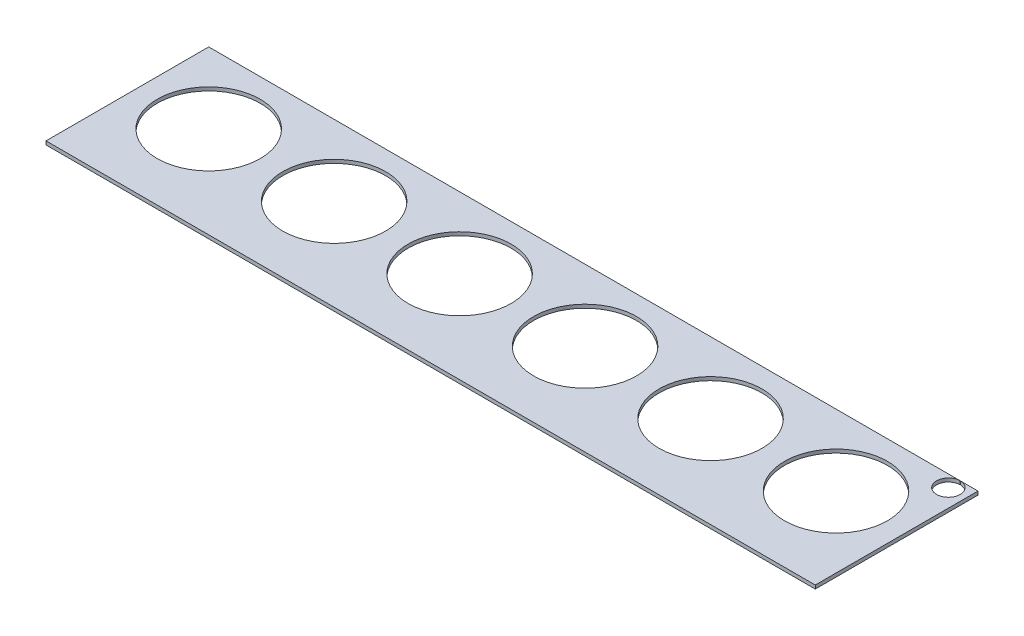
ISO-10303-21;
HEADER;
FILE_DESCRIPTION(('STEP AP214'),'2;1');
FILE_NAME('part.step','',(''),(''),'','','');
FILE_SCHEMA(('AUTOMOTIVE_DESIGN { 1 0 10303 214 1 1 1 1 }'));
ENDSEC;
DATA;
#1=APPLICATION_CONTEXT('core data for automotive mechanical design processes');
#2=APPLICATION_PROTOCOL_DEFINITION('international standard','automotive_design',2000,#1);
#3=PRODUCT_CONTEXT('',#1,'mechanical');
#4=PRODUCT('Part','Part','',(#3));
#5=PRODUCT_RELATED_PRODUCT_CATEGORY('part','',(#4));
#6=PRODUCT_DEFINITION_FORMATION('','',#4);
#7=PRODUCT_DEFINITION_CONTEXT('part definition',#1,'design');
#8=PRODUCT_DEFINITION('design','',#6,#7);
#9=PRODUCT_DEFINITION_SHAPE('','',#8);
#10=(LENGTH_UNIT() NAMED_UNIT(*) SI_UNIT(.MILLI.,.METRE.));
#11=(NAMED_UNIT(*) PLANE_ANGLE_UNIT() SI_UNIT($,.RADIAN.));
#12=(NAMED_UNIT(*) SI_UNIT($,.STERADIAN.) SOLID_ANGLE_UNIT());
#13=UNCERTAINTY_MEASURE_WITH_UNIT(LENGTH_MEASURE(1.E-05),#10,'distance_accuracy_value','');
#14=(GEOMETRIC_REPRESENTATION_CONTEXT(3) GLOBAL_UNCERTAINTY_ASSIGNED_CONTEXT((#13)) GLOBAL_UNIT_ASSIGNED_CONTEXT((#10,
#11,#12)) REPRESENTATION_CONTEXT('',''));
#15=CARTESIAN_POINT('',(0.,0.,0.));
#16=DIRECTION('',(0.,0.,1.));
#17=DIRECTION('',(1.,0.,0.));
#18=AXIS2_PLACEMENT_3D('',#15,#16,#17);
#19=CARTESIAN_POINT('',(-296.850393700788,3.,10.9251968503937));
#20=DIRECTION('',(0.,0.,1.));
#21=DIRECTION('',(1.,0.,0.));
#22=AXIS2_PLACEMENT_3D('',#19,#20,#21);
#23=PLANE('',#22);
#24=DIRECTION('',(-1.,0.,0.));
#25=VECTOR('',#24,1.);
#26=CARTESIAN_POINT('',(-296.850393700788,0.,10.9251968503937));
#27=LINE('',#26,#25);
#28=CARTESIAN_POINT('',(353.149606299212,0.,10.9251968503937));
#29=VERTEX_POINT('',#28);
#30=CARTESIAN_POINT('',(338.29102411987,0.,10.9251968503937));
#31=VERTEX_POINT('',#30);
#32=EDGE_CURVE('E106',#29,#31,#27,.T.);
#33=ORIENTED_EDGE('',*,*,#32,.T.);
#34=DIRECTION('',(0.,1.,0.));
#35=VECTOR('',#34,1.);
#36=CARTESIAN_POINT('',(338.29102411987,-7.,10.9251968503937));
#37=LINE('',#36,#35);
#38=CARTESIAN_POINT('',(338.29102411987,3.,10.9251968503937));
#39=VERTEX_POINT('',#38);
#40=EDGE_CURVE('E51',#31,#39,#37,.T.);
#41=ORIENTED_EDGE('',*,*,#40,.T.);
#42=DIRECTION('',(-1.,0.,0.));
#43=VECTOR('',#42,1.);
#44=CARTESIAN_POINT('',(-296.850393700788,3.,10.9251968503937));
#45=LINE('',#44,#43);
#46=CARTESIAN_POINT('',(353.149606299212,3.,10.9251968503937));
#47=VERTEX_POINT('',#46);
#48=EDGE_CURVE('E104',#47,#39,#45,.T.);
#49=ORIENTED_EDGE('',*,*,#48,.F.);
#50=DIRECTION('',(0.,-1.,0.));
#51=VECTOR('',#50,1.);
#52=CARTESIAN_POINT('',(353.149606299212,3.,10.9251968503937));
#53=LINE('',#52,#51);
#54=EDGE_CURVE('E115',#47,#29,#53,.T.);
#55=ORIENTED_EDGE('',*,*,#54,.T.);
#56=EDGE_LOOP('',(#33,#41,#49,#55));
#57=FACE_BOUND('',#56,.T.);
#58=ADVANCED_FACE('F33',(#57),#23,.F.);
#59=CARTESIAN_POINT('',(-296.850393700788,3.,10.9251968503937));
#60=DIRECTION('',(1.,0.,0.));
#61=DIRECTION('',(0.,0.,-1.));
#62=AXIS2_PLACEMENT_3D('',#59,#60,#61);
#63=PLANE('',#62);
#64=DIRECTION('',(0.,0.,1.));
#65=VECTOR('',#64,1.);
#66=CARTESIAN_POINT('',(-296.850393700788,0.,10.9251968503937));
#67=LINE('',#66,#65);
#68=CARTESIAN_POINT('',(-296.850393700788,0.,10.9251968503937));
#69=VERTEX_POINT('',#68);
#70=CARTESIAN_POINT('',(-296.850393700788,0.,148.425196850394));
#71=VERTEX_POINT('',#70);
#72=EDGE_CURVE('E124',#69,#71,#67,.T.);
#73=ORIENTED_EDGE('',*,*,#72,.T.);
#74=DIRECTION('',(0.,-1.,0.));
#75=VECTOR('',#74,1.);
#76=CARTESIAN_POINT('',(-296.850393700788,3.,148.425196850394));
#77=LINE('',#76,#75);
#78=CARTESIAN_POINT('',(-296.850393700788,3.,148.425196850394));
#79=VERTEX_POINT('',#78);
#80=EDGE_CURVE('E43',#79,#71,#77,.T.);
#81=ORIENTED_EDGE('',*,*,#80,.F.);
#82=DIRECTION('',(0.,0.,1.));
#83=VECTOR('',#82,1.);
#84=CARTESIAN_POINT('',(-296.850393700788,3.,10.9251968503937));
#85=LINE('',#84,#83);
#86=CARTESIAN_POINT('',(-296.850393700788,3.,10.9251968503937));
#87=VERTEX_POINT('',#86);
#88=EDGE_CURVE('E133',#87,#79,#85,.T.);
#89=ORIENTED_EDGE('',*,*,#88,.F.);
#90=DIRECTION('',(0.,-1.,0.));
#91=VECTOR('',#90,1.);
#92=CARTESIAN_POINT('',(-296.850393700788,3.,10.9251968503937));
#93=LINE('',#92,#91);
#94=EDGE_CURVE('E114',#87,#69,#93,.T.);
#95=ORIENTED_EDGE('',*,*,#94,.T.);
#96=EDGE_LOOP('',(#73,#81,#89,#95));
#97=FACE_BOUND('',#96,.T.);
#98=ADVANCED_FACE('F35',(#97),#63,.F.);
#99=CARTESIAN_POINT('',(-296.850393700788,3.,148.425196850394));
#100=DIRECTION('',(0.,0.,-1.));
#101=DIRECTION('',(-1.,0.,0.));
#102=AXIS2_PLACEMENT_3D('',#99,#100,#101);
#103=PLANE('',#102);
#104=DIRECTION('',(1.,0.,0.));
#105=VECTOR('',#104,1.);
#106=CARTESIAN_POINT('',(-296.850393700788,0.,148.425196850394));
#107=LINE('',#106,#105);
#108=CARTESIAN_POINT('',(353.149606299212,0.,148.425196850394));
#109=VERTEX_POINT('',#108);
#110=EDGE_CURVE('E128',#71,#109,#107,.T.);
#111=ORIENTED_EDGE('',*,*,#110,.T.);
#112=DIRECTION('',(0.,-1.,0.));
#113=VECTOR('',#112,1.);
#114=CARTESIAN_POINT('',(353.149606299212,3.,148.425196850394));
#115=LINE('',#114,#113);
#116=CARTESIAN_POINT('',(353.149606299212,3.,148.425196850394));
#117=VERTEX_POINT('',#116);
#118=EDGE_CURVE('E136',#117,#109,#115,.T.);
#119=ORIENTED_EDGE('',*,*,#118,.F.);
#120=DIRECTION('',(1.,0.,0.));
#121=VECTOR('',#120,1.);
#122=CARTESIAN_POINT('',(-296.850393700788,3.,148.425196850394));
#123=LINE('',#122,#121);
#124=EDGE_CURVE('E88',#79,#117,#123,.T.);
#125=ORIENTED_EDGE('',*,*,#124,.F.);
#126=ORIENTED_EDGE('',*,*,#80,.T.);
#127=EDGE_LOOP('',(#111,#119,#125,#126));
#128=FACE_BOUND('',#127,.T.);
#129=ADVANCED_FACE('F180',(#128),#103,.F.);
#130=CARTESIAN_POINT('',(353.149606299212,3.,10.9251968503937));
#131=DIRECTION('',(-1.,0.,0.));
#132=DIRECTION('',(0.,0.,1.));
#133=AXIS2_PLACEMENT_3D('',#130,#131,#132);
#134=PLANE('',#133);
#135=DIRECTION('',(0.,0.,-1.));
#136=VECTOR('',#135,1.);
#137=CARTESIAN_POINT('',(353.149606299212,0.,10.9251968503937));
#138=LINE('',#137,#136);
#139=EDGE_CURVE('E131',#109,#29,#138,.T.);
#140=ORIENTED_EDGE('',*,*,#139,.T.);
#141=ORIENTED_EDGE('',*,*,#54,.F.);
#142=DIRECTION('',(0.,0.,-1.));
#143=VECTOR('',#142,1.);
#144=CARTESIAN_POINT('',(353.149606299212,3.,10.9251968503937));
#145=LINE('',#144,#143);
#146=EDGE_CURVE('E112',#117,#47,#145,.T.);
#147=ORIENTED_EDGE('',*,*,#146,.F.);
#148=ORIENTED_EDGE('',*,*,#118,.T.);
#149=EDGE_LOOP('',(#140,#141,#147,#148));
#150=FACE_BOUND('',#149,.T.);
#151=ADVANCED_FACE('F183',(#150),#134,.F.);
#152=CARTESIAN_POINT('',(338.008188478555,3.,10.9251968503937));
#153=VERTEX_POINT('',#152);
#154=EDGE_CURVE('E37',#153,#87,#45,.T.);
#155=ORIENTED_EDGE('',*,*,#154,.F.);
#156=DIRECTION('',(0.,1.,0.));
#157=VECTOR('',#156,1.);
#158=CARTESIAN_POINT('',(338.008188478555,-7.,10.9251968503937));
#159=LINE('',#158,#157);
#160=CARTESIAN_POINT('',(338.008188478555,0.,10.9251968503937));
#161=VERTEX_POINT('',#160);
#162=EDGE_CURVE('E97',#153,#161,#159,.F.);
#163=ORIENTED_EDGE('',*,*,#162,.T.);
#164=EDGE_CURVE('E80',#161,#69,#27,.T.);
#165=ORIENTED_EDGE('',*,*,#164,.T.);
#166=ORIENTED_EDGE('',*,*,#94,.F.);
#167=EDGE_LOOP('',(#155,#163,#165,#166));
#168=FACE_BOUND('',#167,.T.);
#169=ADVANCED_FACE('F187',(#168),#23,.F.);
#170=CARTESIAN_POINT('',(0.,3.,0.));
#171=DIRECTION('',(0.,1.,0.));
#172=DIRECTION('',(0.,0.,1.));
#173=AXIS2_PLACEMENT_3D('',#170,#171,#172);
#174=PLANE('',#173);
#175=CARTESIAN_POINT('',(338.149606299212,3.,20.9241968503937));
#176=DIRECTION('',(0.,1.,0.));
#177=DIRECTION('',(0.,0.,1.));
#178=AXIS2_PLACEMENT_3D('',#175,#176,#177);
#179=CIRCLE('',#178,9.99999999999998);
#180=EDGE_CURVE('E95',#153,#39,#179,.T.);
#181=ORIENTED_EDGE('',*,*,#180,.F.);
#182=ORIENTED_EDGE('',*,*,#154,.T.);
#183=ORIENTED_EDGE('',*,*,#88,.T.);
#184=ORIENTED_EDGE('',*,*,#124,.T.);
#185=ORIENTED_EDGE('',*,*,#146,.T.);
#186=ORIENTED_EDGE('',*,*,#48,.T.);
#187=EDGE_LOOP('',(#181,#182,#183,#184,#185,#186));
#188=FACE_BOUND('',#187,.T.);
#189=CARTESIAN_POINT('',(293.149606299212,3.,70.9251968503937));
#190=DIRECTION('',(0.,1.,0.));
#191=DIRECTION('',(0.,0.,1.));
#192=AXIS2_PLACEMENT_3D('',#189,#190,#191);
#193=CIRCLE('',#192,43.5);
#194=CARTESIAN_POINT('',(293.149606299212,3.,114.425196850394));
#195=VERTEX_POINT('',#194);
#196=EDGE_CURVE('E146',#195,#195,#193,.T.);
#197=ORIENTED_EDGE('',*,*,#196,.F.);
#198=EDGE_LOOP('',(#197));
#199=FACE_BOUND('',#198,.T.);
#200=CARTESIAN_POINT('',(187.149606299212,3.,70.9251968503937));
#201=DIRECTION('',(0.,1.,0.));
#202=DIRECTION('',(0.,0.,1.));
#203=AXIS2_PLACEMENT_3D('',#200,#201,#202);
#204=CIRCLE('',#203,43.5);
#205=CARTESIAN_POINT('',(187.149606299212,3.,114.425196850394));
#206=VERTEX_POINT('',#205);
#207=EDGE_CURVE('E149',#206,#206,#204,.T.);
#208=ORIENTED_EDGE('',*,*,#207,.F.);
#209=EDGE_LOOP('',(#208));
#210=FACE_BOUND('',#209,.T.);
#211=CARTESIAN_POINT('',(81.1496062992124,3.,70.9251968503937));
#212=DIRECTION('',(0.,1.,0.));
#213=DIRECTION('',(0.,0.,1.));
#214=AXIS2_PLACEMENT_3D('',#211,#212,#213);
#215=CIRCLE('',#214,43.5);
#216=CARTESIAN_POINT('',(81.1496062992124,3.,114.425196850394));
#217=VERTEX_POINT('',#216);
#218=EDGE_CURVE('E155',#217,#217,#215,.T.);
#219=ORIENTED_EDGE('',*,*,#218,.F.);
#220=EDGE_LOOP('',(#219));
#221=FACE_BOUND('',#220,.T.);
#222=CARTESIAN_POINT('',(-24.8503937007876,3.,70.9251968503937));
#223=DIRECTION('',(0.,1.,0.));
#224=DIRECTION('',(0.,0.,1.));
#225=AXIS2_PLACEMENT_3D('',#222,#223,#224);
#226=CIRCLE('',#225,43.5);
#227=CARTESIAN_POINT('',(-24.8503937007876,3.,114.425196850394));
#228=VERTEX_POINT('',#227);
#229=EDGE_CURVE('E161',#228,#228,#226,.T.);
#230=ORIENTED_EDGE('',*,*,#229,.F.);
#231=EDGE_LOOP('',(#230));
#232=FACE_BOUND('',#231,.T.);
#233=CARTESIAN_POINT('',(-130.850393700788,3.,70.9251968503937));
#234=DIRECTION('',(0.,1.,0.));
#235=DIRECTION('',(0.,0.,1.));
#236=AXIS2_PLACEMENT_3D('',#233,#234,#235);
#237=CIRCLE('',#236,43.5);
#238=CARTESIAN_POINT('',(-130.850393700788,3.,114.425196850394));
#239=VERTEX_POINT('',#238);
#240=EDGE_CURVE('E167',#239,#239,#237,.T.);
#241=ORIENTED_EDGE('',*,*,#240,.F.);
#242=EDGE_LOOP('',(#241));
#243=FACE_BOUND('',#242,.T.);
#244=CARTESIAN_POINT('',(-236.850393700788,3.,70.9251968503937));
#245=DIRECTION('',(0.,1.,0.));
#246=DIRECTION('',(0.,0.,1.));
#247=AXIS2_PLACEMENT_3D('',#244,#245,#246);
#248=CIRCLE('',#247,43.5);
#249=CARTESIAN_POINT('',(-236.850393700788,3.,114.425196850394));
#250=VERTEX_POINT('',#249);
#251=EDGE_CURVE('E173',#250,#250,#248,.T.);
#252=ORIENTED_EDGE('',*,*,#251,.F.);
#253=EDGE_LOOP('',(#252));
#254=FACE_BOUND('',#253,.T.);
#255=ADVANCED_FACE('F109',(#188,#199,#210,#221,#232,#243,#254),#174,.T.);
#256=CARTESIAN_POINT('',(0.,0.,0.));
#257=DIRECTION('',(0.,1.,0.));
#258=DIRECTION('',(0.,0.,1.));
#259=AXIS2_PLACEMENT_3D('',#256,#257,#258);
#260=PLANE('',#259);
#261=CARTESIAN_POINT('',(293.149606299212,0.,70.9251968503937));
#262=DIRECTION('',(0.,1.,0.));
#263=DIRECTION('',(0.,0.,1.));
#264=AXIS2_PLACEMENT_3D('',#261,#262,#263);
#265=CIRCLE('',#264,43.5);
#266=CARTESIAN_POINT('',(293.149606299212,0.,114.425196850394));
#267=VERTEX_POINT('',#266);
#268=EDGE_CURVE('E129',#267,#267,#265,.T.);
#269=ORIENTED_EDGE('',*,*,#268,.T.);
#270=EDGE_LOOP('',(#269));
#271=FACE_BOUND('',#270,.T.);
#272=CARTESIAN_POINT('',(187.149606299212,0.,70.9251968503937));
#273=DIRECTION('',(0.,1.,0.));
#274=DIRECTION('',(0.,0.,1.));
#275=AXIS2_PLACEMENT_3D('',#272,#273,#274);
#276=CIRCLE('',#275,43.5);
#277=CARTESIAN_POINT('',(187.149606299212,0.,114.425196850394));
#278=VERTEX_POINT('',#277);
#279=EDGE_CURVE('E152',#278,#278,#276,.T.);
#280=ORIENTED_EDGE('',*,*,#279,.T.);
#281=EDGE_LOOP('',(#280));
#282=FACE_BOUND('',#281,.T.);
#283=CARTESIAN_POINT('',(81.1496062992124,0.,70.9251968503937));
#284=DIRECTION('',(0.,1.,0.));
#285=DIRECTION('',(0.,0.,1.));
#286=AXIS2_PLACEMENT_3D('',#283,#284,#285);
#287=CIRCLE('',#286,43.5);
#288=CARTESIAN_POINT('',(81.1496062992124,0.,114.425196850394));
#289=VERTEX_POINT('',#288);
#290=EDGE_CURVE('E158',#289,#289,#287,.T.);
#291=ORIENTED_EDGE('',*,*,#290,.T.);
#292=EDGE_LOOP('',(#291));
#293=FACE_BOUND('',#292,.T.);
#294=CARTESIAN_POINT('',(-24.8503937007876,0.,70.9251968503937));
#295=DIRECTION('',(0.,1.,0.));
#296=DIRECTION('',(0.,0.,1.));
#297=AXIS2_PLACEMENT_3D('',#294,#295,#296);
#298=CIRCLE('',#297,43.5);
#299=CARTESIAN_POINT('',(-24.8503937007876,0.,114.425196850394));
#300=VERTEX_POINT('',#299);
#301=EDGE_CURVE('E164',#300,#300,#298,.T.);
#302=ORIENTED_EDGE('',*,*,#301,.T.);
#303=EDGE_LOOP('',(#302));
#304=FACE_BOUND('',#303,.T.);
#305=CARTESIAN_POINT('',(-130.850393700788,0.,70.9251968503937));
#306=DIRECTION('',(0.,1.,0.));
#307=DIRECTION('',(0.,0.,1.));
#308=AXIS2_PLACEMENT_3D('',#305,#306,#307);
#309=CIRCLE('',#308,43.5);
#310=CARTESIAN_POINT('',(-130.850393700788,0.,114.425196850394));
#311=VERTEX_POINT('',#310);
#312=EDGE_CURVE('E170',#311,#311,#309,.T.);
#313=ORIENTED_EDGE('',*,*,#312,.T.);
#314=EDGE_LOOP('',(#313));
#315=FACE_BOUND('',#314,.T.);
#316=CARTESIAN_POINT('',(-236.850393700788,0.,70.9251968503937));
#317=DIRECTION('',(0.,1.,0.));
#318=DIRECTION('',(0.,0.,1.));
#319=AXIS2_PLACEMENT_3D('',#316,#317,#318);
#320=CIRCLE('',#319,43.5);
#321=CARTESIAN_POINT('',(-236.850393700788,0.,114.425196850394));
#322=VERTEX_POINT('',#321);
#323=EDGE_CURVE('E107',#322,#322,#320,.T.);
#324=ORIENTED_EDGE('',*,*,#323,.T.);
#325=EDGE_LOOP('',(#324));
#326=FACE_BOUND('',#325,.T.);
#327=ORIENTED_EDGE('',*,*,#164,.F.);
#328=CARTESIAN_POINT('',(338.149606299212,0.,20.9241968503937));
#329=DIRECTION('',(0.,1.,0.));
#330=DIRECTION('',(0.,0.,1.));
#331=AXIS2_PLACEMENT_3D('',#328,#329,#330);
#332=CIRCLE('',#331,9.99999999999998);
#333=EDGE_CURVE('E11',#161,#31,#332,.T.);
#334=ORIENTED_EDGE('',*,*,#333,.T.);
#335=ORIENTED_EDGE('',*,*,#32,.F.);
#336=ORIENTED_EDGE('',*,*,#139,.F.);
#337=ORIENTED_EDGE('',*,*,#110,.F.);
#338=ORIENTED_EDGE('',*,*,#72,.F.);
#339=EDGE_LOOP('',(#327,#334,#335,#336,#337,#338));
#340=FACE_BOUND('',#339,.T.);
#341=ADVANCED_FACE('F185',(#271,#282,#293,#304,#315,#326,#340),#260,.F.);
#342=CARTESIAN_POINT('',(-236.850393700788,0.,70.9251968503937));
#343=DIRECTION('',(0.,1.,0.));
#344=DIRECTION('',(0.,0.,1.));
#345=AXIS2_PLACEMENT_3D('',#342,#343,#344);
#346=CYLINDRICAL_SURFACE('',#345,43.5);
#347=ORIENTED_EDGE('',*,*,#323,.F.);
#348=EDGE_LOOP('',(#347));
#349=FACE_BOUND('',#348,.T.);
#350=ORIENTED_EDGE('',*,*,#251,.T.);
#351=EDGE_LOOP('',(#350));
#352=FACE_BOUND('',#351,.T.);
#353=ADVANCED_FACE('F237',(#349,#352),#346,.F.);
#354=CARTESIAN_POINT('',(-130.850393700788,0.,70.9251968503937));
#355=DIRECTION('',(0.,1.,0.));
#356=DIRECTION('',(0.,0.,1.));
#357=AXIS2_PLACEMENT_3D('',#354,#355,#356);
#358=CYLINDRICAL_SURFACE('',#357,43.5);
#359=ORIENTED_EDGE('',*,*,#312,.F.);
#360=EDGE_LOOP('',(#359));
#361=FACE_BOUND('',#360,.T.);
#362=ORIENTED_EDGE('',*,*,#240,.T.);
#363=EDGE_LOOP('',(#362));
#364=FACE_BOUND('',#363,.T.);
#365=ADVANCED_FACE('F245',(#361,#364),#358,.F.);
#366=CARTESIAN_POINT('',(-24.8503937007876,0.,70.9251968503937));
#367=DIRECTION('',(0.,1.,0.));
#368=DIRECTION('',(0.,0.,1.));
#369=AXIS2_PLACEMENT_3D('',#366,#367,#368);
#370=CYLINDRICAL_SURFACE('',#369,43.5);
#371=ORIENTED_EDGE('',*,*,#301,.F.);
#372=EDGE_LOOP('',(#371));
#373=FACE_BOUND('',#372,.T.);
#374=ORIENTED_EDGE('',*,*,#229,.T.);
#375=EDGE_LOOP('',(#374));
#376=FACE_BOUND('',#375,.T.);
#377=ADVANCED_FACE('F254',(#373,#376),#370,.F.);
#378=CARTESIAN_POINT('',(81.1496062992124,0.,70.9251968503937));
#379=DIRECTION('',(0.,1.,0.));
#380=DIRECTION('',(0.,0.,1.));
#381=AXIS2_PLACEMENT_3D('',#378,#379,#380);
#382=CYLINDRICAL_SURFACE('',#381,43.5);
#383=ORIENTED_EDGE('',*,*,#290,.F.);
#384=EDGE_LOOP('',(#383));
#385=FACE_BOUND('',#384,.T.);
#386=ORIENTED_EDGE('',*,*,#218,.T.);
#387=EDGE_LOOP('',(#386));
#388=FACE_BOUND('',#387,.T.);
#389=ADVANCED_FACE('F263',(#385,#388),#382,.F.);
#390=CARTESIAN_POINT('',(187.149606299212,0.,70.9251968503937));
#391=DIRECTION('',(0.,1.,0.));
#392=DIRECTION('',(0.,0.,1.));
#393=AXIS2_PLACEMENT_3D('',#390,#391,#392);
#394=CYLINDRICAL_SURFACE('',#393,43.5);
#395=ORIENTED_EDGE('',*,*,#279,.F.);
#396=EDGE_LOOP('',(#395));
#397=FACE_BOUND('',#396,.T.);
#398=ORIENTED_EDGE('',*,*,#207,.T.);
#399=EDGE_LOOP('',(#398));
#400=FACE_BOUND('',#399,.T.);
#401=ADVANCED_FACE('F272',(#397,#400),#394,.F.);
#402=CARTESIAN_POINT('',(293.149606299212,0.,70.9251968503937));
#403=DIRECTION('',(0.,1.,0.));
#404=DIRECTION('',(0.,0.,1.));
#405=AXIS2_PLACEMENT_3D('',#402,#403,#404);
#406=CYLINDRICAL_SURFACE('',#405,43.5);
#407=ORIENTED_EDGE('',*,*,#268,.F.);
#408=EDGE_LOOP('',(#407));
#409=FACE_BOUND('',#408,.T.);
#410=ORIENTED_EDGE('',*,*,#196,.T.);
#411=EDGE_LOOP('',(#410));
#412=FACE_BOUND('',#411,.T.);
#413=ADVANCED_FACE('F281',(#409,#412),#406,.F.);
#414=CARTESIAN_POINT('',(338.149606299212,-7.,20.9241968503937));
#415=DIRECTION('',(0.,1.,0.));
#416=DIRECTION('',(0.,0.,1.));
#417=AXIS2_PLACEMENT_3D('',#414,#415,#416);
#418=CYLINDRICAL_SURFACE('',#417,9.99999999999998);
#419=ORIENTED_EDGE('',*,*,#333,.F.);
#420=ORIENTED_EDGE('',*,*,#162,.F.);
#421=ORIENTED_EDGE('',*,*,#180,.T.);
#422=ORIENTED_EDGE('',*,*,#40,.F.);
#423=EDGE_LOOP('',(#419,#420,#421,#422));
#424=FACE_BOUND('',#423,.T.);
#425=ADVANCED_FACE('F96',(#424),#418,.F.);
#426=CLOSED_SHELL('',(#58,#98,#129,#151,#169,#255,#341,#353,#365,#377,#389,#401,#413,#425));
#427=MANIFOLD_SOLID_BREP('B2',#426);
#428=ADVANCED_BREP_SHAPE_REPRESENTATION('',(#18,#427),#14);
#429=SHAPE_DEFINITION_REPRESENTATION(#9,#428);
ENDSEC;
END-ISO-10303-21;
